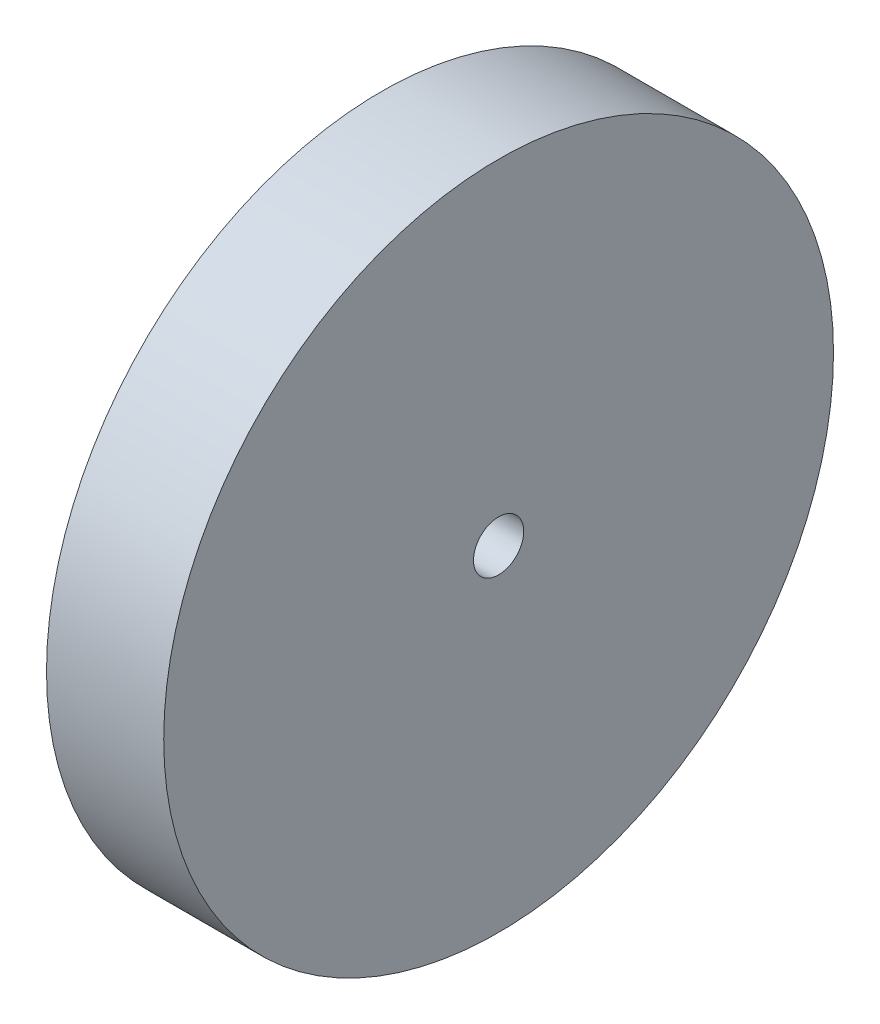
ISO-10303-21;
HEADER;
FILE_DESCRIPTION(('STEP AP214'),'2;1');
FILE_NAME('part.step','',(''),(''),'','','');
FILE_SCHEMA(('AUTOMOTIVE_DESIGN { 1 0 10303 214 1 1 1 1 }'));
ENDSEC;
DATA;
#1=APPLICATION_CONTEXT('core data for automotive mechanical design processes');
#2=APPLICATION_PROTOCOL_DEFINITION('international standard','automotive_design',2000,#1);
#3=PRODUCT_CONTEXT('',#1,'mechanical');
#4=PRODUCT('Part','Part','',(#3));
#5=PRODUCT_RELATED_PRODUCT_CATEGORY('part','',(#4));
#6=PRODUCT_DEFINITION_FORMATION('','',#4);
#7=PRODUCT_DEFINITION_CONTEXT('part definition',#1,'design');
#8=PRODUCT_DEFINITION('design','',#6,#7);
#9=PRODUCT_DEFINITION_SHAPE('','',#8);
#10=(LENGTH_UNIT() NAMED_UNIT(*) SI_UNIT(.MILLI.,.METRE.));
#11=(NAMED_UNIT(*) PLANE_ANGLE_UNIT() SI_UNIT($,.RADIAN.));
#12=(NAMED_UNIT(*) SI_UNIT($,.STERADIAN.) SOLID_ANGLE_UNIT());
#13=UNCERTAINTY_MEASURE_WITH_UNIT(LENGTH_MEASURE(1.E-05),#10,'distance_accuracy_value','');
#14=(GEOMETRIC_REPRESENTATION_CONTEXT(3) GLOBAL_UNCERTAINTY_ASSIGNED_CONTEXT((#13)) GLOBAL_UNIT_ASSIGNED_CONTEXT((#10,
#11,#12)) REPRESENTATION_CONTEXT('',''));
#15=CARTESIAN_POINT('',(0.,0.,0.));
#16=DIRECTION('',(0.,0.,1.));
#17=DIRECTION('',(1.,0.,0.));
#18=AXIS2_PLACEMENT_3D('',#15,#16,#17);
#19=CARTESIAN_POINT('',(3.5,0.,0.));
#20=DIRECTION('',(-1.,0.,0.));
#21=DIRECTION('',(0.,0.,1.));
#22=AXIS2_PLACEMENT_3D('',#19,#20,#21);
#23=CYLINDRICAL_SURFACE('',#22,20.);
#24=CARTESIAN_POINT('',(3.5,0.,0.));
#25=DIRECTION('',(1.,0.,0.));
#26=DIRECTION('',(0.,0.,-1.));
#27=AXIS2_PLACEMENT_3D('',#24,#25,#26);
#28=CIRCLE('',#27,20.);
#29=CARTESIAN_POINT('',(3.5,0.,-20.));
#30=VERTEX_POINT('',#29);
#31=EDGE_CURVE('E10',#30,#30,#28,.T.);
#32=ORIENTED_EDGE('',*,*,#31,.F.);
#33=EDGE_LOOP('',(#32));
#34=FACE_BOUND('',#33,.T.);
#35=CARTESIAN_POINT('',(-3.5,0.,0.));
#36=DIRECTION('',(1.,0.,0.));
#37=DIRECTION('',(0.,0.,-1.));
#38=AXIS2_PLACEMENT_3D('',#35,#36,#37);
#39=CIRCLE('',#38,20.);
#40=CARTESIAN_POINT('',(-3.5,0.,-20.));
#41=VERTEX_POINT('',#40);
#42=EDGE_CURVE('E46',#41,#41,#39,.T.);
#43=ORIENTED_EDGE('',*,*,#42,.T.);
#44=EDGE_LOOP('',(#43));
#45=FACE_BOUND('',#44,.T.);
#46=ADVANCED_FACE('F43',(#34,#45),#23,.T.);
#47=CARTESIAN_POINT('',(3.5,0.,0.));
#48=DIRECTION('',(1.,0.,0.));
#49=DIRECTION('',(0.,0.,-1.));
#50=AXIS2_PLACEMENT_3D('',#47,#48,#49);
#51=PLANE('',#50);
#52=CARTESIAN_POINT('',(3.5,0.,0.));
#53=DIRECTION('',(1.,0.,0.));
#54=DIRECTION('',(0.,0.,-1.));
#55=AXIS2_PLACEMENT_3D('',#52,#53,#54);
#56=CIRCLE('',#55,1.5);
#57=CARTESIAN_POINT('',(3.5,0.,-1.5));
#58=VERTEX_POINT('',#57);
#59=EDGE_CURVE('E57',#58,#58,#56,.T.);
#60=ORIENTED_EDGE('',*,*,#59,.F.);
#61=EDGE_LOOP('',(#60));
#62=FACE_BOUND('',#61,.T.);
#63=ORIENTED_EDGE('',*,*,#31,.T.);
#64=EDGE_LOOP('',(#63));
#65=FACE_BOUND('',#64,.T.);
#66=ADVANCED_FACE('F74',(#62,#65),#51,.T.);
#67=CARTESIAN_POINT('',(-3.5,0.,0.));
#68=DIRECTION('',(1.,0.,0.));
#69=DIRECTION('',(0.,0.,-1.));
#70=AXIS2_PLACEMENT_3D('',#67,#68,#69);
#71=PLANE('',#70);
#72=CARTESIAN_POINT('',(-3.5,0.,0.));
#73=DIRECTION('',(1.,0.,0.));
#74=DIRECTION('',(0.,0.,-1.));
#75=AXIS2_PLACEMENT_3D('',#72,#73,#74);
#76=CIRCLE('',#75,1.5);
#77=CARTESIAN_POINT('',(-3.5,0.,-1.5));
#78=VERTEX_POINT('',#77);
#79=EDGE_CURVE('E55',#78,#78,#76,.T.);
#80=ORIENTED_EDGE('',*,*,#79,.T.);
#81=EDGE_LOOP('',(#80));
#82=FACE_BOUND('',#81,.T.);
#83=ORIENTED_EDGE('',*,*,#42,.F.);
#84=EDGE_LOOP('',(#83));
#85=FACE_BOUND('',#84,.T.);
#86=ADVANCED_FACE('F65',(#82,#85),#71,.F.);
#87=CARTESIAN_POINT('',(-3.5,0.,0.));
#88=DIRECTION('',(1.,0.,0.));
#89=DIRECTION('',(0.,0.,-1.));
#90=AXIS2_PLACEMENT_3D('',#87,#88,#89);
#91=CYLINDRICAL_SURFACE('',#90,1.5);
#92=ORIENTED_EDGE('',*,*,#79,.F.);
#93=EDGE_LOOP('',(#92));
#94=FACE_BOUND('',#93,.T.);
#95=ORIENTED_EDGE('',*,*,#59,.T.);
#96=EDGE_LOOP('',(#95));
#97=FACE_BOUND('',#96,.T.);
#98=ADVANCED_FACE('F68',(#94,#97),#91,.F.);
#99=CLOSED_SHELL('',(#46,#66,#86,#98));
#100=MANIFOLD_SOLID_BREP('B2',#99);
#101=ADVANCED_BREP_SHAPE_REPRESENTATION('',(#18,#100),#14);
#102=SHAPE_DEFINITION_REPRESENTATION(#9,#101);
ENDSEC;
END-ISO-10303-21;
